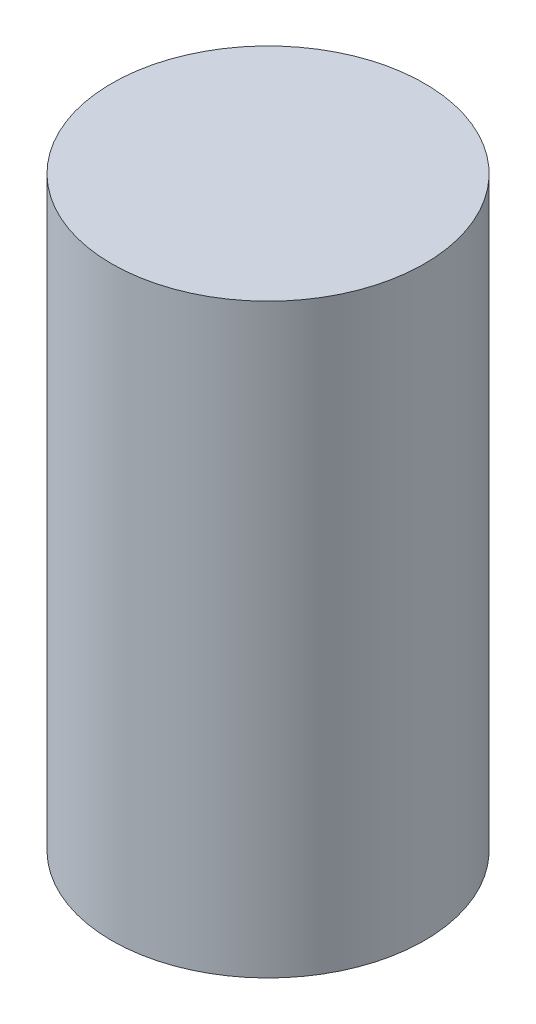
ISO-10303-21;
HEADER;
FILE_DESCRIPTION(('STEP AP214'),'2;1');
FILE_NAME('part.step','',(''),(''),'','','');
FILE_SCHEMA(('AUTOMOTIVE_DESIGN { 1 0 10303 214 1 1 1 1 }'));
ENDSEC;
DATA;
#1=APPLICATION_CONTEXT('core data for automotive mechanical design processes');
#2=APPLICATION_PROTOCOL_DEFINITION('international standard','automotive_design',2000,#1);
#3=PRODUCT_CONTEXT('',#1,'mechanical');
#4=PRODUCT('Part','Part','',(#3));
#5=PRODUCT_RELATED_PRODUCT_CATEGORY('part','',(#4));
#6=PRODUCT_DEFINITION_FORMATION('','',#4);
#7=PRODUCT_DEFINITION_CONTEXT('part definition',#1,'design');
#8=PRODUCT_DEFINITION('design','',#6,#7);
#9=PRODUCT_DEFINITION_SHAPE('','',#8);
#10=(LENGTH_UNIT() NAMED_UNIT(*) SI_UNIT(.MILLI.,.METRE.));
#11=(NAMED_UNIT(*) PLANE_ANGLE_UNIT() SI_UNIT($,.RADIAN.));
#12=(NAMED_UNIT(*) SI_UNIT($,.STERADIAN.) SOLID_ANGLE_UNIT());
#13=UNCERTAINTY_MEASURE_WITH_UNIT(LENGTH_MEASURE(1.E-05),#10,'distance_accuracy_value','');
#14=(GEOMETRIC_REPRESENTATION_CONTEXT(3) GLOBAL_UNCERTAINTY_ASSIGNED_CONTEXT((#13)) GLOBAL_UNIT_ASSIGNED_CONTEXT((#10,
#11,#12)) REPRESENTATION_CONTEXT('',''));
#15=CARTESIAN_POINT('',(0.,0.,0.));
#16=DIRECTION('',(0.,0.,1.));
#17=DIRECTION('',(1.,0.,0.));
#18=AXIS2_PLACEMENT_3D('',#15,#16,#17);
#19=CARTESIAN_POINT('',(0.,261.874,0.));
#20=DIRECTION('',(0.,-1.,0.));
#21=DIRECTION('',(0.,0.,-1.));
#22=AXIS2_PLACEMENT_3D('',#19,#20,#21);
#23=CYLINDRICAL_SURFACE('',#22,69.85);
#24=CARTESIAN_POINT('',(0.,261.874,0.));
#25=DIRECTION('',(0.,1.,0.));
#26=DIRECTION('',(0.,0.,1.));
#27=AXIS2_PLACEMENT_3D('',#24,#25,#26);
#28=CIRCLE('',#27,69.85);
#29=CARTESIAN_POINT('',(0.,261.874,69.85));
#30=VERTEX_POINT('',#29);
#31=EDGE_CURVE('E10',#30,#30,#28,.T.);
#32=ORIENTED_EDGE('',*,*,#31,.F.);
#33=EDGE_LOOP('',(#32));
#34=FACE_BOUND('',#33,.T.);
#35=CARTESIAN_POINT('',(0.,0.,0.));
#36=DIRECTION('',(0.,1.,0.));
#37=DIRECTION('',(0.,0.,1.));
#38=AXIS2_PLACEMENT_3D('',#35,#36,#37);
#39=CIRCLE('',#38,69.85);
#40=CARTESIAN_POINT('',(0.,0.,69.85));
#41=VERTEX_POINT('',#40);
#42=EDGE_CURVE('E34',#41,#41,#39,.T.);
#43=ORIENTED_EDGE('',*,*,#42,.T.);
#44=EDGE_LOOP('',(#43));
#45=FACE_BOUND('',#44,.T.);
#46=ADVANCED_FACE('F31',(#34,#45),#23,.T.);
#47=CARTESIAN_POINT('',(0.,261.874,0.));
#48=DIRECTION('',(0.,1.,0.));
#49=DIRECTION('',(0.,0.,1.));
#50=AXIS2_PLACEMENT_3D('',#47,#48,#49);
#51=PLANE('',#50);
#52=ORIENTED_EDGE('',*,*,#31,.T.);
#53=EDGE_LOOP('',(#52));
#54=FACE_BOUND('',#53,.T.);
#55=ADVANCED_FACE('F46',(#54),#51,.T.);
#56=CARTESIAN_POINT('',(0.,0.,0.));
#57=DIRECTION('',(0.,1.,0.));
#58=DIRECTION('',(0.,0.,1.));
#59=AXIS2_PLACEMENT_3D('',#56,#57,#58);
#60=PLANE('',#59);
#61=ORIENTED_EDGE('',*,*,#42,.F.);
#62=EDGE_LOOP('',(#61));
#63=FACE_BOUND('',#62,.T.);
#64=ADVANCED_FACE('F44',(#63),#60,.F.);
#65=CLOSED_SHELL('',(#46,#55,#64));
#66=MANIFOLD_SOLID_BREP('B2',#65);
#67=ADVANCED_BREP_SHAPE_REPRESENTATION('',(#18,#66),#14);
#68=SHAPE_DEFINITION_REPRESENTATION(#9,#67);
ENDSEC;
END-ISO-10303-21;
